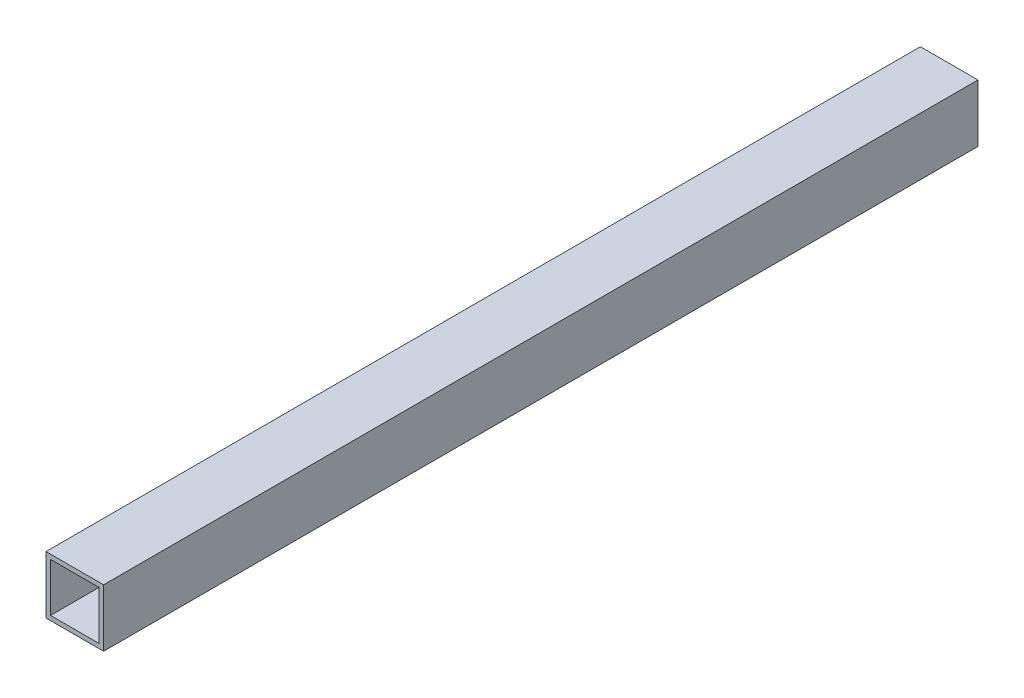
ISO-10303-21;
HEADER;
FILE_DESCRIPTION(('STEP AP214'),'2;1');
FILE_NAME('part.step','',(''),(''),'','','');
FILE_SCHEMA(('AUTOMOTIVE_DESIGN { 1 0 10303 214 1 1 1 1 }'));
ENDSEC;
DATA;
#1=APPLICATION_CONTEXT('core data for automotive mechanical design processes');
#2=APPLICATION_PROTOCOL_DEFINITION('international standard','automotive_design',2000,#1);
#3=PRODUCT_CONTEXT('',#1,'mechanical');
#4=PRODUCT('Part','Part','',(#3));
#5=PRODUCT_RELATED_PRODUCT_CATEGORY('part','',(#4));
#6=PRODUCT_DEFINITION_FORMATION('','',#4);
#7=PRODUCT_DEFINITION_CONTEXT('part definition',#1,'design');
#8=PRODUCT_DEFINITION('design','',#6,#7);
#9=PRODUCT_DEFINITION_SHAPE('','',#8);
#10=(LENGTH_UNIT() NAMED_UNIT(*) SI_UNIT(.MILLI.,.METRE.));
#11=(NAMED_UNIT(*) PLANE_ANGLE_UNIT() SI_UNIT($,.RADIAN.));
#12=(NAMED_UNIT(*) SI_UNIT($,.STERADIAN.) SOLID_ANGLE_UNIT());
#13=UNCERTAINTY_MEASURE_WITH_UNIT(LENGTH_MEASURE(1.E-05),#10,'distance_accuracy_value','');
#14=(GEOMETRIC_REPRESENTATION_CONTEXT(3) GLOBAL_UNCERTAINTY_ASSIGNED_CONTEXT((#13)) GLOBAL_UNIT_ASSIGNED_CONTEXT((#10,
#11,#12)) REPRESENTATION_CONTEXT('',''));
#15=CARTESIAN_POINT('',(0.,0.,0.));
#16=DIRECTION('',(0.,0.,1.));
#17=DIRECTION('',(1.,0.,0.));
#18=AXIS2_PLACEMENT_3D('',#15,#16,#17);
#19=CARTESIAN_POINT('',(0.,0.,290.));
#20=DIRECTION('',(0.,0.,1.));
#21=DIRECTION('',(1.,0.,0.));
#22=AXIS2_PLACEMENT_3D('',#19,#20,#21);
#23=PLANE('',#22);
#24=DIRECTION('',(0.,1.,0.));
#25=VECTOR('',#24,1.);
#26=CARTESIAN_POINT('',(9.55,9.55,290.));
#27=LINE('',#26,#25);
#28=CARTESIAN_POINT('',(9.55,-9.55,290.));
#29=VERTEX_POINT('',#28);
#30=CARTESIAN_POINT('',(9.55,9.55,290.));
#31=VERTEX_POINT('',#30);
#32=EDGE_CURVE('E134',#29,#31,#27,.T.);
#33=ORIENTED_EDGE('',*,*,#32,.T.);
#34=DIRECTION('',(-1.,0.,0.));
#35=VECTOR('',#34,1.);
#36=CARTESIAN_POINT('',(-9.55,9.55,290.));
#37=LINE('',#36,#35);
#38=CARTESIAN_POINT('',(-9.55,9.55,290.));
#39=VERTEX_POINT('',#38);
#40=EDGE_CURVE('E137',#31,#39,#37,.T.);
#41=ORIENTED_EDGE('',*,*,#40,.T.);
#42=DIRECTION('',(0.,-1.,0.));
#43=VECTOR('',#42,1.);
#44=CARTESIAN_POINT('',(-9.55,9.55,290.));
#45=LINE('',#44,#43);
#46=CARTESIAN_POINT('',(-9.55,-9.55,290.));
#47=VERTEX_POINT('',#46);
#48=EDGE_CURVE('E140',#39,#47,#45,.T.);
#49=ORIENTED_EDGE('',*,*,#48,.T.);
#50=DIRECTION('',(1.,0.,0.));
#51=VECTOR('',#50,1.);
#52=CARTESIAN_POINT('',(-9.55,-9.55,290.));
#53=LINE('',#52,#51);
#54=EDGE_CURVE('E142',#47,#29,#53,.T.);
#55=ORIENTED_EDGE('',*,*,#54,.T.);
#56=EDGE_LOOP('',(#33,#41,#49,#55));
#57=FACE_BOUND('',#56,.T.);
#58=DIRECTION('',(-1.,0.,0.));
#59=VECTOR('',#58,1.);
#60=CARTESIAN_POINT('',(-8.05,8.05,290.));
#61=LINE('',#60,#59);
#62=CARTESIAN_POINT('',(8.05,8.05,290.));
#63=VERTEX_POINT('',#62);
#64=CARTESIAN_POINT('',(-8.05,8.05,290.));
#65=VERTEX_POINT('',#64);
#66=EDGE_CURVE('E106',#63,#65,#61,.T.);
#67=ORIENTED_EDGE('',*,*,#66,.F.);
#68=DIRECTION('',(0.,1.,0.));
#69=VECTOR('',#68,1.);
#70=CARTESIAN_POINT('',(8.05,8.05,290.));
#71=LINE('',#70,#69);
#72=CARTESIAN_POINT('',(8.05,-8.05,290.));
#73=VERTEX_POINT('',#72);
#74=EDGE_CURVE('E98',#73,#63,#71,.T.);
#75=ORIENTED_EDGE('',*,*,#74,.F.);
#76=DIRECTION('',(1.,0.,0.));
#77=VECTOR('',#76,1.);
#78=CARTESIAN_POINT('',(-8.05,-8.05,290.));
#79=LINE('',#78,#77);
#80=CARTESIAN_POINT('',(-8.05,-8.05,290.));
#81=VERTEX_POINT('',#80);
#82=EDGE_CURVE('E120',#81,#73,#79,.T.);
#83=ORIENTED_EDGE('',*,*,#82,.F.);
#84=DIRECTION('',(0.,-1.,0.));
#85=VECTOR('',#84,1.);
#86=CARTESIAN_POINT('',(-8.05,8.05,290.));
#87=LINE('',#86,#85);
#88=EDGE_CURVE('E118',#65,#81,#87,.T.);
#89=ORIENTED_EDGE('',*,*,#88,.F.);
#90=EDGE_LOOP('',(#67,#75,#83,#89));
#91=FACE_BOUND('',#90,.T.);
#92=ADVANCED_FACE('F33',(#57,#91),#23,.T.);
#93=CARTESIAN_POINT('',(0.,0.,0.));
#94=DIRECTION('',(0.,0.,1.));
#95=DIRECTION('',(1.,0.,0.));
#96=AXIS2_PLACEMENT_3D('',#93,#94,#95);
#97=PLANE('',#96);
#98=DIRECTION('',(0.,1.,0.));
#99=VECTOR('',#98,1.);
#100=CARTESIAN_POINT('',(9.55,9.55,0.));
#101=LINE('',#100,#99);
#102=CARTESIAN_POINT('',(9.55,-9.55,0.));
#103=VERTEX_POINT('',#102);
#104=CARTESIAN_POINT('',(9.55,9.55,0.));
#105=VERTEX_POINT('',#104);
#106=EDGE_CURVE('E114',#103,#105,#101,.T.);
#107=ORIENTED_EDGE('',*,*,#106,.F.);
#108=DIRECTION('',(1.,0.,0.));
#109=VECTOR('',#108,1.);
#110=CARTESIAN_POINT('',(-9.55,-9.55,0.));
#111=LINE('',#110,#109);
#112=CARTESIAN_POINT('',(-9.55,-9.55,0.));
#113=VERTEX_POINT('',#112);
#114=EDGE_CURVE('E138',#113,#103,#111,.T.);
#115=ORIENTED_EDGE('',*,*,#114,.F.);
#116=DIRECTION('',(0.,-1.,0.));
#117=VECTOR('',#116,1.);
#118=CARTESIAN_POINT('',(-9.55,9.55,0.));
#119=LINE('',#118,#117);
#120=CARTESIAN_POINT('',(-9.55,9.55,0.));
#121=VERTEX_POINT('',#120);
#122=EDGE_CURVE('E149',#121,#113,#119,.T.);
#123=ORIENTED_EDGE('',*,*,#122,.F.);
#124=DIRECTION('',(-1.,0.,0.));
#125=VECTOR('',#124,1.);
#126=CARTESIAN_POINT('',(-9.55,9.55,0.));
#127=LINE('',#126,#125);
#128=EDGE_CURVE('E147',#105,#121,#127,.T.);
#129=ORIENTED_EDGE('',*,*,#128,.F.);
#130=EDGE_LOOP('',(#107,#115,#123,#129));
#131=FACE_BOUND('',#130,.T.);
#132=DIRECTION('',(0.,1.,0.));
#133=VECTOR('',#132,1.);
#134=CARTESIAN_POINT('',(8.05,8.05,0.));
#135=LINE('',#134,#133);
#136=CARTESIAN_POINT('',(8.05,-8.05,0.));
#137=VERTEX_POINT('',#136);
#138=CARTESIAN_POINT('',(8.05,8.05,0.));
#139=VERTEX_POINT('',#138);
#140=EDGE_CURVE('E56',#137,#139,#135,.T.);
#141=ORIENTED_EDGE('',*,*,#140,.T.);
#142=DIRECTION('',(-1.,0.,0.));
#143=VECTOR('',#142,1.);
#144=CARTESIAN_POINT('',(-8.05,8.05,0.));
#145=LINE('',#144,#143);
#146=CARTESIAN_POINT('',(-8.05,8.05,0.));
#147=VERTEX_POINT('',#146);
#148=EDGE_CURVE('E113',#139,#147,#145,.T.);
#149=ORIENTED_EDGE('',*,*,#148,.T.);
#150=DIRECTION('',(0.,-1.,0.));
#151=VECTOR('',#150,1.);
#152=CARTESIAN_POINT('',(-8.05,8.05,0.));
#153=LINE('',#152,#151);
#154=CARTESIAN_POINT('',(-8.05,-8.05,0.));
#155=VERTEX_POINT('',#154);
#156=EDGE_CURVE('E126',#147,#155,#153,.T.);
#157=ORIENTED_EDGE('',*,*,#156,.T.);
#158=DIRECTION('',(1.,0.,0.));
#159=VECTOR('',#158,1.);
#160=CARTESIAN_POINT('',(-8.05,-8.05,0.));
#161=LINE('',#160,#159);
#162=EDGE_CURVE('E107',#155,#137,#161,.T.);
#163=ORIENTED_EDGE('',*,*,#162,.T.);
#164=EDGE_LOOP('',(#141,#149,#157,#163));
#165=FACE_BOUND('',#164,.T.);
#166=ADVANCED_FACE('F167',(#131,#165),#97,.F.);
#167=CARTESIAN_POINT('',(9.55,9.55,290.));
#168=DIRECTION('',(-1.,0.,0.));
#169=DIRECTION('',(0.,0.,1.));
#170=AXIS2_PLACEMENT_3D('',#167,#168,#169);
#171=PLANE('',#170);
#172=ORIENTED_EDGE('',*,*,#106,.T.);
#173=DIRECTION('',(0.,0.,-1.));
#174=VECTOR('',#173,1.);
#175=CARTESIAN_POINT('',(9.55,9.55,290.));
#176=LINE('',#175,#174);
#177=EDGE_CURVE('E11',#31,#105,#176,.T.);
#178=ORIENTED_EDGE('',*,*,#177,.F.);
#179=ORIENTED_EDGE('',*,*,#32,.F.);
#180=DIRECTION('',(0.,0.,-1.));
#181=VECTOR('',#180,1.);
#182=CARTESIAN_POINT('',(9.55,-9.55,290.));
#183=LINE('',#182,#181);
#184=EDGE_CURVE('E144',#29,#103,#183,.T.);
#185=ORIENTED_EDGE('',*,*,#184,.T.);
#186=EDGE_LOOP('',(#172,#178,#179,#185));
#187=FACE_BOUND('',#186,.T.);
#188=ADVANCED_FACE('F35',(#187),#171,.F.);
#189=CARTESIAN_POINT('',(-9.55,9.55,290.));
#190=DIRECTION('',(0.,-1.,0.));
#191=DIRECTION('',(0.,0.,-1.));
#192=AXIS2_PLACEMENT_3D('',#189,#190,#191);
#193=PLANE('',#192);
#194=ORIENTED_EDGE('',*,*,#128,.T.);
#195=DIRECTION('',(0.,0.,-1.));
#196=VECTOR('',#195,1.);
#197=CARTESIAN_POINT('',(-9.55,9.55,290.));
#198=LINE('',#197,#196);
#199=EDGE_CURVE('E41',#39,#121,#198,.T.);
#200=ORIENTED_EDGE('',*,*,#199,.F.);
#201=ORIENTED_EDGE('',*,*,#40,.F.);
#202=ORIENTED_EDGE('',*,*,#177,.T.);
#203=EDGE_LOOP('',(#194,#200,#201,#202));
#204=FACE_BOUND('',#203,.T.);
#205=ADVANCED_FACE('F177',(#204),#193,.F.);
#206=CARTESIAN_POINT('',(-9.55,9.55,290.));
#207=DIRECTION('',(1.,0.,0.));
#208=DIRECTION('',(0.,0.,-1.));
#209=AXIS2_PLACEMENT_3D('',#206,#207,#208);
#210=PLANE('',#209);
#211=ORIENTED_EDGE('',*,*,#122,.T.);
#212=DIRECTION('',(0.,0.,-1.));
#213=VECTOR('',#212,1.);
#214=CARTESIAN_POINT('',(-9.55,-9.55,290.));
#215=LINE('',#214,#213);
#216=EDGE_CURVE('E154',#47,#113,#215,.T.);
#217=ORIENTED_EDGE('',*,*,#216,.F.);
#218=ORIENTED_EDGE('',*,*,#48,.F.);
#219=ORIENTED_EDGE('',*,*,#199,.T.);
#220=EDGE_LOOP('',(#211,#217,#218,#219));
#221=FACE_BOUND('',#220,.T.);
#222=ADVANCED_FACE('F161',(#221),#210,.F.);
#223=CARTESIAN_POINT('',(-9.55,-9.55,290.));
#224=DIRECTION('',(0.,1.,0.));
#225=DIRECTION('',(0.,0.,1.));
#226=AXIS2_PLACEMENT_3D('',#223,#224,#225);
#227=PLANE('',#226);
#228=ORIENTED_EDGE('',*,*,#114,.T.);
#229=ORIENTED_EDGE('',*,*,#184,.F.);
#230=ORIENTED_EDGE('',*,*,#54,.F.);
#231=ORIENTED_EDGE('',*,*,#216,.T.);
#232=EDGE_LOOP('',(#228,#229,#230,#231));
#233=FACE_BOUND('',#232,.T.);
#234=ADVANCED_FACE('F171',(#233),#227,.F.);
#235=CARTESIAN_POINT('',(8.05,8.05,290.));
#236=DIRECTION('',(-1.,0.,0.));
#237=DIRECTION('',(0.,0.,1.));
#238=AXIS2_PLACEMENT_3D('',#235,#236,#237);
#239=PLANE('',#238);
#240=ORIENTED_EDGE('',*,*,#140,.F.);
#241=DIRECTION('',(0.,0.,-1.));
#242=VECTOR('',#241,1.);
#243=CARTESIAN_POINT('',(8.05,-8.05,290.));
#244=LINE('',#243,#242);
#245=EDGE_CURVE('E102',#73,#137,#244,.T.);
#246=ORIENTED_EDGE('',*,*,#245,.F.);
#247=ORIENTED_EDGE('',*,*,#74,.T.);
#248=DIRECTION('',(0.,0.,-1.));
#249=VECTOR('',#248,1.);
#250=CARTESIAN_POINT('',(8.05,8.05,290.));
#251=LINE('',#250,#249);
#252=EDGE_CURVE('E101',#63,#139,#251,.T.);
#253=ORIENTED_EDGE('',*,*,#252,.T.);
#254=EDGE_LOOP('',(#240,#246,#247,#253));
#255=FACE_BOUND('',#254,.T.);
#256=ADVANCED_FACE('F100',(#255),#239,.T.);
#257=CARTESIAN_POINT('',(-8.05,8.05,290.));
#258=DIRECTION('',(0.,-1.,0.));
#259=DIRECTION('',(0.,0.,-1.));
#260=AXIS2_PLACEMENT_3D('',#257,#258,#259);
#261=PLANE('',#260);
#262=ORIENTED_EDGE('',*,*,#148,.F.);
#263=ORIENTED_EDGE('',*,*,#252,.F.);
#264=ORIENTED_EDGE('',*,*,#66,.T.);
#265=DIRECTION('',(0.,0.,-1.));
#266=VECTOR('',#265,1.);
#267=CARTESIAN_POINT('',(-8.05,8.05,290.));
#268=LINE('',#267,#266);
#269=EDGE_CURVE('E115',#65,#147,#268,.T.);
#270=ORIENTED_EDGE('',*,*,#269,.T.);
#271=EDGE_LOOP('',(#262,#263,#264,#270));
#272=FACE_BOUND('',#271,.T.);
#273=ADVANCED_FACE('F110',(#272),#261,.T.);
#274=CARTESIAN_POINT('',(-8.05,8.05,290.));
#275=DIRECTION('',(1.,0.,0.));
#276=DIRECTION('',(0.,0.,-1.));
#277=AXIS2_PLACEMENT_3D('',#274,#275,#276);
#278=PLANE('',#277);
#279=ORIENTED_EDGE('',*,*,#156,.F.);
#280=ORIENTED_EDGE('',*,*,#269,.F.);
#281=ORIENTED_EDGE('',*,*,#88,.T.);
#282=DIRECTION('',(0.,0.,-1.));
#283=VECTOR('',#282,1.);
#284=CARTESIAN_POINT('',(-8.05,-8.05,290.));
#285=LINE('',#284,#283);
#286=EDGE_CURVE('E48',#81,#155,#285,.T.);
#287=ORIENTED_EDGE('',*,*,#286,.T.);
#288=EDGE_LOOP('',(#279,#280,#281,#287));
#289=FACE_BOUND('',#288,.T.);
#290=ADVANCED_FACE('F200',(#289),#278,.T.);
#291=CARTESIAN_POINT('',(-8.05,-8.05,290.));
#292=DIRECTION('',(0.,1.,0.));
#293=DIRECTION('',(0.,0.,1.));
#294=AXIS2_PLACEMENT_3D('',#291,#292,#293);
#295=PLANE('',#294);
#296=ORIENTED_EDGE('',*,*,#162,.F.);
#297=ORIENTED_EDGE('',*,*,#286,.F.);
#298=ORIENTED_EDGE('',*,*,#82,.T.);
#299=ORIENTED_EDGE('',*,*,#245,.T.);
#300=EDGE_LOOP('',(#296,#297,#298,#299));
#301=FACE_BOUND('',#300,.T.);
#302=ADVANCED_FACE('F204',(#301),#295,.T.);
#303=CLOSED_SHELL('',(#92,#166,#188,#205,#222,#234,#256,#273,#290,#302));
#304=MANIFOLD_SOLID_BREP('B2',#303);
#305=ADVANCED_BREP_SHAPE_REPRESENTATION('',(#18,#304),#14);
#306=SHAPE_DEFINITION_REPRESENTATION(#9,#305);
ENDSEC;
END-ISO-10303-21;
